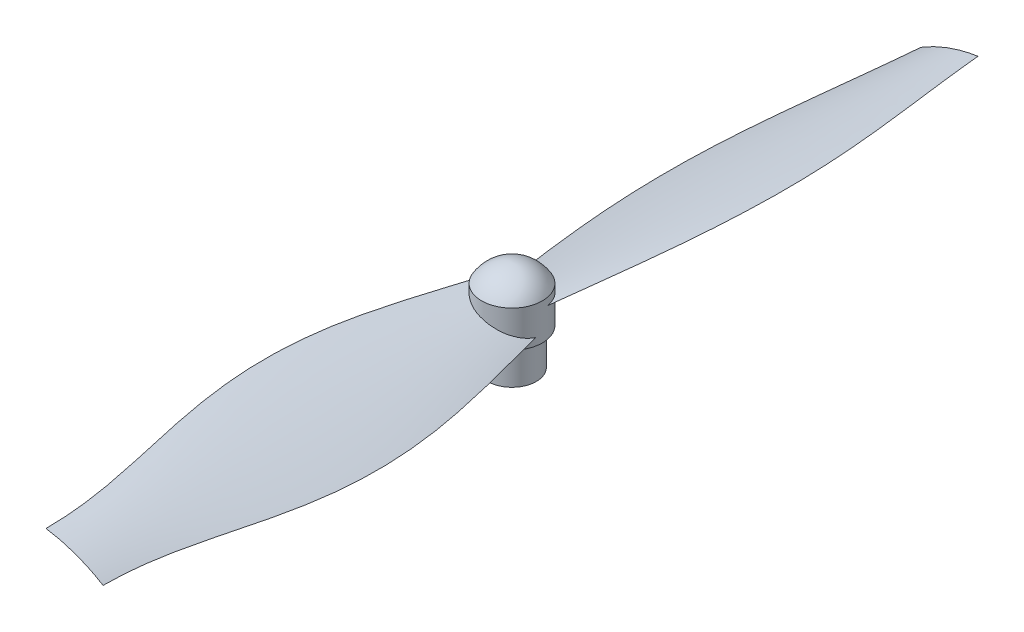
ISO-10303-21;
HEADER;
FILE_DESCRIPTION(('STEP AP214'),'2;1');
FILE_NAME('part.step','',(''),(''),'','','');
FILE_SCHEMA(('AUTOMOTIVE_DESIGN { 1 0 10303 214 1 1 1 1 }'));
ENDSEC;
DATA;
#1=APPLICATION_CONTEXT('core data for automotive mechanical design processes');
#2=APPLICATION_PROTOCOL_DEFINITION('international standard','automotive_design',2000,#1);
#3=PRODUCT_CONTEXT('',#1,'mechanical');
#4=PRODUCT('Part','Part','',(#3));
#5=PRODUCT_RELATED_PRODUCT_CATEGORY('part','',(#4));
#6=PRODUCT_DEFINITION_FORMATION('','',#4);
#7=PRODUCT_DEFINITION_CONTEXT('part definition',#1,'design');
#8=PRODUCT_DEFINITION('design','',#6,#7);
#9=PRODUCT_DEFINITION_SHAPE('','',#8);
#10=(LENGTH_UNIT() NAMED_UNIT(*) SI_UNIT(.MILLI.,.METRE.));
#11=(NAMED_UNIT(*) PLANE_ANGLE_UNIT() SI_UNIT($,.RADIAN.));
#12=(NAMED_UNIT(*) SI_UNIT($,.STERADIAN.) SOLID_ANGLE_UNIT());
#13=UNCERTAINTY_MEASURE_WITH_UNIT(LENGTH_MEASURE(1.E-05),#10,'distance_accuracy_value','');
#14=(GEOMETRIC_REPRESENTATION_CONTEXT(3) GLOBAL_UNCERTAINTY_ASSIGNED_CONTEXT((#13)) GLOBAL_UNIT_ASSIGNED_CONTEXT((#10,
#11,#12)) REPRESENTATION_CONTEXT('',''));
#15=CARTESIAN_POINT('',(0.,0.,0.));
#16=DIRECTION('',(0.,0.,1.));
#17=DIRECTION('',(1.,0.,0.));
#18=AXIS2_PLACEMENT_3D('',#15,#16,#17);
#19=CARTESIAN_POINT('',(4.69846310392954,10.7101007166284,0.));
#20=DIRECTION('',(0.342020143325673,-0.939692620785907,0.));
#21=DIRECTION('',(-0.939692620785907,-0.342020143325673,0.));
#22=AXIS2_PLACEMENT_3D('',#19,#20,#21);
#23=PLANE('',#22);
#24=DIRECTION('',(-0.939692620785907,-0.342020143325672,0.));
#25=VECTOR('',#24,1.);
#26=CARTESIAN_POINT('',(0.,9.,0.));
#27=LINE('',#26,#25);
#28=CARTESIAN_POINT('',(4.69846310392954,10.7101007166284,0.));
#29=VERTEX_POINT('',#28);
#30=CARTESIAN_POINT('',(-4.69846310392954,7.28989928337163,0.));
#31=VERTEX_POINT('',#30);
#32=EDGE_CURVE('E86',#29,#31,#27,.T.);
#33=ORIENTED_EDGE('',*,*,#32,.T.);
#34=CARTESIAN_POINT('',(-4.69846310392954,7.28989928337163,0.));
#35=CARTESIAN_POINT('',(-4.69846310392954,7.28989928337163,-0.679869268479036));
#36=CARTESIAN_POINT('',(-13.5458454476314,4.06971545909178,-38.1838953513858));
#37=CARTESIAN_POINT('',(-7.20431009269195,6.37784556783652,-54.6666666666667));
#38=CARTESIAN_POINT('',(-4.69846310392953,7.28989928337164,-72.));
#39=B_SPLINE_CURVE_WITH_KNOTS('',3,(#34,#35,#36,#37,#38),.UNSPECIFIED.,.F.,.F.,(4,1,4),(0.,
0.279461519936665,1.),.UNSPECIFIED.);
#40=CARTESIAN_POINT('',(-4.69846310392953,7.28989928337164,-72.));
#41=VERTEX_POINT('',#40);
#42=EDGE_CURVE('E85',#31,#41,#39,.T.);
#43=ORIENTED_EDGE('',*,*,#42,.T.);
#44=DIRECTION('',(0.939692620785907,0.342020143325673,0.));
#45=VECTOR('',#44,1.);
#46=CARTESIAN_POINT('',(0.,9.00000000000001,-72.));
#47=LINE('',#46,#45);
#48=CARTESIAN_POINT('',(4.69846310392953,10.7101007166284,-72.));
#49=VERTEX_POINT('',#48);
#50=EDGE_CURVE('E72',#41,#49,#47,.T.);
#51=ORIENTED_EDGE('',*,*,#50,.T.);
#52=CARTESIAN_POINT('',(4.69846310392954,10.7101007166284,0.));
#53=CARTESIAN_POINT('',(4.69846310392954,10.7101007166284,-0.67986926847904));
#54=CARTESIAN_POINT('',(13.5458454476314,13.9302845409082,-38.1838953513861));
#55=CARTESIAN_POINT('',(7.20431009269195,11.6221544321635,-54.6666666666667));
#56=CARTESIAN_POINT('',(4.69846310392953,10.7101007166284,-72.));
#57=B_SPLINE_CURVE_WITH_KNOTS('',3,(#52,#53,#54,#55,#56),.UNSPECIFIED.,.F.,.F.,(4,1,4),(0.,
0.279461519936665,1.),.UNSPECIFIED.);
#58=EDGE_CURVE('E84',#49,#29,#57,.F.);
#59=ORIENTED_EDGE('',*,*,#58,.T.);
#60=EDGE_LOOP('',(#33,#43,#51,#59));
#61=FACE_BOUND('',#60,.T.);
#62=ADVANCED_FACE('F53',(#61),#23,.T.);
#63=CARTESIAN_POINT('',(-4.69846310392954,7.28989928337164,0.));
#64=CARTESIAN_POINT('',(-4.69846310392954,7.28989928337164,-0.679869268479036));
#65=CARTESIAN_POINT('',(-13.5458454476314,4.06971545909173,-38.1838953513858));
#66=CARTESIAN_POINT('',(-7.20431009269197,6.3778455678365,-54.6666666666667));
#67=CARTESIAN_POINT('',(-4.69846310392953,7.28989928337164,-72.));
#68=CARTESIAN_POINT('',(-1.82850177394058,9.05116134838688,0.));
#69=CARTESIAN_POINT('',(-1.82850177394058,9.05116134838688,-0.679869268479038));
#70=CARTESIAN_POINT('',(-4.74599248789099,7.99901139309018,-38.1838953513859));
#71=CARTESIAN_POINT('',(-2.66378410352807,8.74714344320849,-54.6666666666667));
#72=CARTESIAN_POINT('',(-1.82850177394058,9.05116134838688,-72.));
#73=CARTESIAN_POINT('',(1.36782774232243,10.2145301512131,0.));
#74=CARTESIAN_POINT('',(1.36782774232243,10.2145301512131,-0.679869268479039));
#75=CARTESIAN_POINT('',(4.27906424639223,11.2838634069331,-38.183895351386));
#76=CARTESIAN_POINT('',(2.20311007190989,10.5185480563915,-54.6666666666667));
#77=CARTESIAN_POINT('',(1.36782774232243,10.2145301512131,-72.));
#78=CARTESIAN_POINT('',(4.69846310392954,10.7101007166284,0.));
#79=CARTESIAN_POINT('',(4.69846310392954,10.7101007166284,-0.67986926847904));
#80=CARTESIAN_POINT('',(13.5458454476314,13.9302845409082,-38.1838953513861));
#81=CARTESIAN_POINT('',(7.20431009269195,11.6221544321635,-54.6666666666667));
#82=CARTESIAN_POINT('',(4.69846310392953,10.7101007166284,-72.));
#83=B_SPLINE_SURFACE_WITH_KNOTS('',3,3,((#63,#64,#65,#66,#67),(#68,#69,#70,#71,#72),(#73,#74,
#75,#76,#77),(#78,#79,#80,#81,#82)),.UNSPECIFIED.,.F.,.F.,.F.,(4,4),(4,1,4),(0.,1.),(0.,
0.279461519936665,1.),.UNSPECIFIED.);
#84=CARTESIAN_POINT('',(-4.69846310392954,7.28989928337164,0.));
#85=CARTESIAN_POINT('',(-1.82850177394058,9.05116134838688,0.));
#86=CARTESIAN_POINT('',(1.36782774232243,10.2145301512131,0.));
#87=CARTESIAN_POINT('',(4.69846310392954,10.7101007166284,0.));
#88=B_SPLINE_CURVE_WITH_KNOTS('',3,(#84,#85,#86,#87),.UNSPECIFIED.,.F.,.F.,(4,4),(0.,1.),.UNSPECIFIED.);
#89=EDGE_CURVE('E13',#31,#29,#88,.T.);
#90=CARTESIAN_POINT('',(-4.69846310392953,7.28989928337164,-72.));
#91=CARTESIAN_POINT('',(-1.82850177394058,9.05116134838688,-72.));
#92=CARTESIAN_POINT('',(1.36782774232243,10.2145301512131,-72.));
#93=CARTESIAN_POINT('',(4.69846310392953,10.7101007166284,-72.));
#94=B_SPLINE_CURVE_WITH_KNOTS('',3,(#90,#91,#92,#93),.UNSPECIFIED.,.F.,.F.,(4,4),(0.,1.),.UNSPECIFIED.);
#95=EDGE_CURVE('E58',#49,#41,#94,.F.);
#96=ORIENTED_EDGE('',*,*,#89,.T.);
#97=ORIENTED_EDGE('',*,*,#58,.F.);
#98=ORIENTED_EDGE('',*,*,#95,.T.);
#99=ORIENTED_EDGE('',*,*,#42,.F.);
#100=EDGE_LOOP('',(#96,#97,#98,#99));
#101=FACE_BOUND('',#100,.T.);
#102=ADVANCED_FACE('F54',(#101),#83,.T.);
#103=OPEN_SHELL('',(#62,#102));
#104=SHELL_BASED_SURFACE_MODEL('B2',(#103));
#105=CARTESIAN_POINT('',(-4.69846310392954,10.7101007166284,0.));
#106=CARTESIAN_POINT('',(-4.69846310392954,10.7101007166284,0.679869268479038));
#107=CARTESIAN_POINT('',(-14.03179298249,14.1071549790119,38.1938255156309));
#108=CARTESIAN_POINT('',(-4.69846310392954,10.7101007166284,54.6154602527929));
#109=CARTESIAN_POINT('',(-4.69846310392954,10.7101007166284,72.));
#110=CARTESIAN_POINT('',(-1.36782774232243,10.2145301512131,0.));
#111=CARTESIAN_POINT('',(-1.36782774232243,10.2145301512131,0.679869268479038));
#112=CARTESIAN_POINT('',(-4.44104675804527,11.3428202196379,38.1938255156309));
#113=CARTESIAN_POINT('',(-1.36782774232243,10.2145301512131,54.6154602527929));
#114=CARTESIAN_POINT('',(-1.36782774232243,10.2145301512131,72.));
#115=CARTESIAN_POINT('',(1.82850177394058,9.05116134838688,0.));
#116=CARTESIAN_POINT('',(1.82850177394059,9.05116134838688,0.679869268479038));
#117=CARTESIAN_POINT('',(4.90797499953851,7.9400545803703,38.1938255156309));
#118=CARTESIAN_POINT('',(1.82850177394058,9.05116134838688,54.6154602527929));
#119=CARTESIAN_POINT('',(1.82850177394058,9.05116134838688,72.));
#120=CARTESIAN_POINT('',(4.69846310392954,7.28989928337164,0.));
#121=CARTESIAN_POINT('',(4.69846310392954,7.28989928337164,0.679869268479038));
#122=CARTESIAN_POINT('',(14.0317929824901,3.89284502098825,38.1938255156309));
#123=CARTESIAN_POINT('',(4.69846310392954,7.28989928337164,54.6154602527929));
#124=CARTESIAN_POINT('',(4.69846310392954,7.28989928337164,72.));
#125=B_SPLINE_SURFACE_WITH_KNOTS('',3,3,((#105,#106,#107,#108,#109),(#110,#111,#112,#113,#114),
(#115,#116,#117,#118,#119),(#120,#121,#122,#123,#124)),.UNSPECIFIED.,.F.,.F.,.F.,(4,4),(4,1,4),
(0.,1.),(0.,0.279461520340345,1.),.UNSPECIFIED.);
#126=CARTESIAN_POINT('',(-4.69846310392954,10.7101007166284,0.));
#127=CARTESIAN_POINT('',(-1.36782774232243,10.2145301512131,0.));
#128=CARTESIAN_POINT('',(1.82850177394058,9.05116134838688,0.));
#129=CARTESIAN_POINT('',(4.69846310392954,7.28989928337164,0.));
#130=B_SPLINE_CURVE_WITH_KNOTS('',3,(#126,#127,#128,#129),.UNSPECIFIED.,.F.,.F.,(4,4),(0.,1.),.UNSPECIFIED.);
#131=CARTESIAN_POINT('',(-4.69846310392954,10.7101007166284,0.));
#132=VERTEX_POINT('',#131);
#133=CARTESIAN_POINT('',(4.69846310392954,7.28989928337164,0.));
#134=VERTEX_POINT('',#133);
#135=EDGE_CURVE('E51',#132,#134,#130,.T.);
#136=CARTESIAN_POINT('',(4.69846310392954,7.28989928337164,0.));
#137=CARTESIAN_POINT('',(4.69846310392954,7.28989928337164,0.679869268479038));
#138=CARTESIAN_POINT('',(14.0317929824901,3.89284502098825,38.1938255156309));
#139=CARTESIAN_POINT('',(4.69846310392954,7.28989928337164,54.6154602527929));
#140=CARTESIAN_POINT('',(4.69846310392954,7.28989928337164,72.));
#141=B_SPLINE_CURVE_WITH_KNOTS('',3,(#136,#137,#138,#139,#140),.UNSPECIFIED.,.F.,.F.,(4,1,4),
(0.,0.279461520340345,1.),.UNSPECIFIED.);
#142=CARTESIAN_POINT('',(4.69846310392954,7.28989928337164,72.));
#143=VERTEX_POINT('',#142);
#144=EDGE_CURVE('E163',#134,#143,#141,.T.);
#145=CARTESIAN_POINT('',(-4.69846310392954,10.7101007166284,72.));
#146=CARTESIAN_POINT('',(-1.36782774232243,10.2145301512131,72.));
#147=CARTESIAN_POINT('',(1.82850177394058,9.05116134838688,72.));
#148=CARTESIAN_POINT('',(4.69846310392954,7.28989928337164,72.));
#149=B_SPLINE_CURVE_WITH_KNOTS('',3,(#145,#146,#147,#148),.UNSPECIFIED.,.F.,.F.,(4,4),(0.,1.),.UNSPECIFIED.);
#150=CARTESIAN_POINT('',(-4.69846310392954,10.7101007166284,72.));
#151=VERTEX_POINT('',#150);
#152=EDGE_CURVE('E171',#143,#151,#149,.F.);
#153=CARTESIAN_POINT('',(-4.69846310392954,10.7101007166284,0.));
#154=CARTESIAN_POINT('',(-4.69846310392954,10.7101007166284,0.679869268479038));
#155=CARTESIAN_POINT('',(-14.03179298249,14.1071549790119,38.1938255156309));
#156=CARTESIAN_POINT('',(-4.69846310392954,10.7101007166284,54.6154602527929));
#157=CARTESIAN_POINT('',(-4.69846310392954,10.7101007166284,72.));
#158=B_SPLINE_CURVE_WITH_KNOTS('',3,(#153,#154,#155,#156,#157),.UNSPECIFIED.,.F.,.F.,(4,1,4),
(0.,0.279461520340345,1.),.UNSPECIFIED.);
#159=EDGE_CURVE('E155',#151,#132,#158,.F.);
#160=ORIENTED_EDGE('',*,*,#135,.T.);
#161=ORIENTED_EDGE('',*,*,#144,.T.);
#162=ORIENTED_EDGE('',*,*,#152,.T.);
#163=ORIENTED_EDGE('',*,*,#159,.T.);
#164=EDGE_LOOP('',(#160,#161,#162,#163));
#165=FACE_BOUND('',#164,.T.);
#166=ADVANCED_FACE('F152',(#165),#125,.T.);
#167=OPEN_SHELL('',(#166));
#168=SHELL_BASED_SURFACE_MODEL('B7',(#167));
#169=CARTESIAN_POINT('',(0.,0.,0.));
#170=DIRECTION('',(0.,-1.,0.));
#171=DIRECTION('',(0.,0.,-1.));
#172=AXIS2_PLACEMENT_3D('',#169,#170,#171);
#173=PLANE('',#172);
#174=DIRECTION('',(0.5,0.,0.866025403784439));
#175=VECTOR('',#174,1.);
#176=CARTESIAN_POINT('',(1.44337567297407,0.,-2.5));
#177=LINE('',#176,#175);
#178=CARTESIAN_POINT('',(1.44337567297407,0.,-2.5));
#179=VERTEX_POINT('',#178);
#180=CARTESIAN_POINT('',(2.88675134594813,0.,0.));
#181=VERTEX_POINT('',#180);
#182=EDGE_CURVE('E238',#179,#181,#177,.T.);
#183=ORIENTED_EDGE('',*,*,#182,.F.);
#184=DIRECTION('',(1.,0.,0.));
#185=VECTOR('',#184,1.);
#186=CARTESIAN_POINT('',(-1.44337567297406,0.,-2.5));
#187=LINE('',#186,#185);
#188=CARTESIAN_POINT('',(-1.44337567297406,0.,-2.5));
#189=VERTEX_POINT('',#188);
#190=EDGE_CURVE('E297',#189,#179,#187,.T.);
#191=ORIENTED_EDGE('',*,*,#190,.F.);
#192=DIRECTION('',(0.5,0.,-0.866025403784438));
#193=VECTOR('',#192,1.);
#194=CARTESIAN_POINT('',(-2.88675134594813,0.,0.));
#195=LINE('',#194,#193);
#196=CARTESIAN_POINT('',(-2.88675134594813,0.,0.));
#197=VERTEX_POINT('',#196);
#198=EDGE_CURVE('E300',#197,#189,#195,.T.);
#199=ORIENTED_EDGE('',*,*,#198,.F.);
#200=DIRECTION('',(-0.5,0.,-0.866025403784438));
#201=VECTOR('',#200,1.);
#202=CARTESIAN_POINT('',(-1.44337567297406,0.,2.5));
#203=LINE('',#202,#201);
#204=CARTESIAN_POINT('',(-1.44337567297406,0.,2.5));
#205=VERTEX_POINT('',#204);
#206=EDGE_CURVE('E316',#205,#197,#203,.T.);
#207=ORIENTED_EDGE('',*,*,#206,.F.);
#208=DIRECTION('',(-1.,0.,0.));
#209=VECTOR('',#208,1.);
#210=CARTESIAN_POINT('',(1.44337567297406,0.,2.5));
#211=LINE('',#210,#209);
#212=CARTESIAN_POINT('',(1.44337567297406,0.,2.5));
#213=VERTEX_POINT('',#212);
#214=EDGE_CURVE('E313',#213,#205,#211,.T.);
#215=ORIENTED_EDGE('',*,*,#214,.F.);
#216=DIRECTION('',(-0.5,0.,0.866025403784438));
#217=VECTOR('',#216,1.);
#218=CARTESIAN_POINT('',(2.88675134594813,0.,0.));
#219=LINE('',#218,#217);
#220=EDGE_CURVE('E311',#181,#213,#219,.T.);
#221=ORIENTED_EDGE('',*,*,#220,.F.);
#222=EDGE_LOOP('',(#183,#191,#199,#207,#215,#221));
#223=FACE_BOUND('',#222,.T.);
#224=CARTESIAN_POINT('',(0.,0.,0.));
#225=DIRECTION('',(0.,-1.,0.));
#226=DIRECTION('',(0.,0.,-1.));
#227=AXIS2_PLACEMENT_3D('',#224,#225,#226);
#228=CIRCLE('',#227,4.);
#229=CARTESIAN_POINT('',(0.,0.,-4.));
#230=VERTEX_POINT('',#229);
#231=EDGE_CURVE('E323',#230,#230,#228,.T.);
#232=ORIENTED_EDGE('',*,*,#231,.T.);
#233=EDGE_LOOP('',(#232));
#234=FACE_BOUND('',#233,.T.);
#235=ADVANCED_FACE('F224',(#223,#234),#173,.T.);
#236=CARTESIAN_POINT('',(0.,9.00326916134687,0.19803850319188));
#237=DIRECTION('',(-1.,0.,0.));
#238=DIRECTION('',(0.,0.,-1.));
#239=AXIS2_PLACEMENT_3D('',#236,#237,#238);
#240=CIRCLE('',#239,6.);
#241=TRIMMED_CURVE('',#240,(PARAMETER_VALUE(-1.53778391366149)),
(PARAMETER_VALUE(1.53778391366149)),.T.,.PARAMETER.);
#242=CARTESIAN_POINT('',(0.,9.00326916134687,0.));
#243=DIRECTION('',(0.,-1.,0.));
#244=AXIS1_PLACEMENT('',#242,#243);
#245=SURFACE_OF_REVOLUTION('',#241,#244);
#246=CARTESIAN_POINT('',(0.,15.,0.));
#247=VERTEX_POINT('',#246);
#248=VERTEX_LOOP('',#247);
#249=FACE_BOUND('',#248,.T.);
#250=CARTESIAN_POINT('',(0.,12.,0.));
#251=DIRECTION('',(0.,-1.,0.));
#252=DIRECTION('',(0.,0.,-1.));
#253=AXIS2_PLACEMENT_3D('',#250,#251,#252);
#254=CIRCLE('',#253,5.);
#255=CARTESIAN_POINT('',(0.,12.,-5.));
#256=VERTEX_POINT('',#255);
#257=EDGE_CURVE('E150',#256,#256,#254,.T.);
#258=ORIENTED_EDGE('',*,*,#257,.F.);
#259=EDGE_LOOP('',(#258));
#260=FACE_BOUND('',#259,.T.);
#261=ADVANCED_FACE('F343',(#249,#260),#245,.T.);
#262=CARTESIAN_POINT('',(0.,0.,0.));
#263=DIRECTION('',(0.,-1.,0.));
#264=DIRECTION('',(0.,0.,-1.));
#265=AXIS2_PLACEMENT_3D('',#262,#263,#264);
#266=CYLINDRICAL_SURFACE('',#265,5.);
#267=ORIENTED_EDGE('',*,*,#257,.T.);
#268=EDGE_LOOP('',(#267));
#269=FACE_BOUND('',#268,.T.);
#270=CARTESIAN_POINT('',(0.,6.,0.));
#271=DIRECTION('',(0.,-1.,0.));
#272=DIRECTION('',(0.,0.,-1.));
#273=AXIS2_PLACEMENT_3D('',#270,#271,#272);
#274=CIRCLE('',#273,5.);
#275=CARTESIAN_POINT('',(0.,6.,-5.));
#276=VERTEX_POINT('',#275);
#277=EDGE_CURVE('E231',#276,#276,#274,.T.);
#278=ORIENTED_EDGE('',*,*,#277,.F.);
#279=EDGE_LOOP('',(#278));
#280=FACE_BOUND('',#279,.T.);
#281=ADVANCED_FACE('F341',(#269,#280),#266,.T.);
#282=CARTESIAN_POINT('',(4.,6.,0.));
#283=DIRECTION('',(0.,-1.,0.));
#284=DIRECTION('',(0.,0.,-1.));
#285=AXIS2_PLACEMENT_3D('',#282,#283,#284);
#286=PLANE('',#285);
#287=ORIENTED_EDGE('',*,*,#277,.T.);
#288=EDGE_LOOP('',(#287));
#289=FACE_BOUND('',#288,.T.);
#290=CARTESIAN_POINT('',(0.,6.,0.));
#291=DIRECTION('',(0.,-1.,0.));
#292=DIRECTION('',(0.,0.,-1.));
#293=AXIS2_PLACEMENT_3D('',#290,#291,#292);
#294=CIRCLE('',#293,4.);
#295=CARTESIAN_POINT('',(0.,6.,-4.));
#296=VERTEX_POINT('',#295);
#297=EDGE_CURVE('E333',#296,#296,#294,.T.);
#298=ORIENTED_EDGE('',*,*,#297,.F.);
#299=EDGE_LOOP('',(#298));
#300=FACE_BOUND('',#299,.T.);
#301=ADVANCED_FACE('F338',(#289,#300),#286,.T.);
#302=CARTESIAN_POINT('',(0.,0.,0.));
#303=DIRECTION('',(0.,-1.,0.));
#304=DIRECTION('',(0.,0.,-1.));
#305=AXIS2_PLACEMENT_3D('',#302,#303,#304);
#306=CYLINDRICAL_SURFACE('',#305,4.);
#307=ORIENTED_EDGE('',*,*,#297,.T.);
#308=EDGE_LOOP('',(#307));
#309=FACE_BOUND('',#308,.T.);
#310=ORIENTED_EDGE('',*,*,#231,.F.);
#311=EDGE_LOOP('',(#310));
#312=FACE_BOUND('',#311,.T.);
#313=ADVANCED_FACE('F350',(#309,#312),#306,.T.);
#314=CARTESIAN_POINT('',(1.44337567297407,7.,-2.5));
#315=DIRECTION('',(0.866025403784438,0.,-0.5));
#316=DIRECTION('',(-0.5,0.,-0.866025403784439));
#317=AXIS2_PLACEMENT_3D('',#314,#315,#316);
#318=PLANE('',#317);
#319=ORIENTED_EDGE('',*,*,#182,.T.);
#320=DIRECTION('',(0.,-1.,0.));
#321=VECTOR('',#320,1.);
#322=CARTESIAN_POINT('',(2.88675134594813,7.,0.));
#323=LINE('',#322,#321);
#324=CARTESIAN_POINT('',(2.88675134594813,7.,0.));
#325=VERTEX_POINT('',#324);
#326=EDGE_CURVE('E274',#325,#181,#323,.T.);
#327=ORIENTED_EDGE('',*,*,#326,.F.);
#328=DIRECTION('',(0.5,0.,0.866025403784439));
#329=VECTOR('',#328,1.);
#330=CARTESIAN_POINT('',(1.44337567297407,7.,-2.5));
#331=LINE('',#330,#329);
#332=CARTESIAN_POINT('',(1.44337567297407,7.,-2.5));
#333=VERTEX_POINT('',#332);
#334=EDGE_CURVE('E278',#333,#325,#331,.T.);
#335=ORIENTED_EDGE('',*,*,#334,.F.);
#336=DIRECTION('',(0.,-1.,0.));
#337=VECTOR('',#336,1.);
#338=CARTESIAN_POINT('',(1.44337567297407,7.,-2.5));
#339=LINE('',#338,#337);
#340=EDGE_CURVE('E321',#333,#179,#339,.T.);
#341=ORIENTED_EDGE('',*,*,#340,.T.);
#342=EDGE_LOOP('',(#319,#327,#335,#341));
#343=FACE_BOUND('',#342,.T.);
#344=ADVANCED_FACE('F276',(#343),#318,.F.);
#345=CARTESIAN_POINT('',(-1.44337567297406,7.,-2.5));
#346=DIRECTION('',(0.,0.,-1.));
#347=DIRECTION('',(-1.,0.,0.));
#348=AXIS2_PLACEMENT_3D('',#345,#346,#347);
#349=PLANE('',#348);
#350=ORIENTED_EDGE('',*,*,#190,.T.);
#351=ORIENTED_EDGE('',*,*,#340,.F.);
#352=DIRECTION('',(1.,0.,0.));
#353=VECTOR('',#352,1.);
#354=CARTESIAN_POINT('',(-1.44337567297406,7.,-2.5));
#355=LINE('',#354,#353);
#356=CARTESIAN_POINT('',(-1.44337567297406,7.,-2.5));
#357=VERTEX_POINT('',#356);
#358=EDGE_CURVE('E284',#357,#333,#355,.T.);
#359=ORIENTED_EDGE('',*,*,#358,.F.);
#360=DIRECTION('',(0.,-1.,0.));
#361=VECTOR('',#360,1.);
#362=CARTESIAN_POINT('',(-1.44337567297406,7.,-2.5));
#363=LINE('',#362,#361);
#364=EDGE_CURVE('E324',#357,#189,#363,.T.);
#365=ORIENTED_EDGE('',*,*,#364,.T.);
#366=EDGE_LOOP('',(#350,#351,#359,#365));
#367=FACE_BOUND('',#366,.T.);
#368=ADVANCED_FACE('F366',(#367),#349,.F.);
#369=CARTESIAN_POINT('',(-2.88675134594813,7.,0.));
#370=DIRECTION('',(-0.866025403784438,0.,-0.5));
#371=DIRECTION('',(-0.5,0.,0.866025403784438));
#372=AXIS2_PLACEMENT_3D('',#369,#370,#371);
#373=PLANE('',#372);
#374=ORIENTED_EDGE('',*,*,#198,.T.);
#375=ORIENTED_EDGE('',*,*,#364,.F.);
#376=DIRECTION('',(0.5,0.,-0.866025403784438));
#377=VECTOR('',#376,1.);
#378=CARTESIAN_POINT('',(-2.88675134594813,7.,0.));
#379=LINE('',#378,#377);
#380=CARTESIAN_POINT('',(-2.88675134594813,7.,0.));
#381=VERTEX_POINT('',#380);
#382=EDGE_CURVE('E307',#381,#357,#379,.T.);
#383=ORIENTED_EDGE('',*,*,#382,.F.);
#384=DIRECTION('',(0.,-1.,0.));
#385=VECTOR('',#384,1.);
#386=CARTESIAN_POINT('',(-2.88675134594813,7.,0.));
#387=LINE('',#386,#385);
#388=EDGE_CURVE('E326',#381,#197,#387,.T.);
#389=ORIENTED_EDGE('',*,*,#388,.T.);
#390=EDGE_LOOP('',(#374,#375,#383,#389));
#391=FACE_BOUND('',#390,.T.);
#392=ADVANCED_FACE('F378',(#391),#373,.F.);
#393=CARTESIAN_POINT('',(-1.44337567297406,7.,2.5));
#394=DIRECTION('',(-0.866025403784438,0.,0.5));
#395=DIRECTION('',(0.5,0.,0.866025403784439));
#396=AXIS2_PLACEMENT_3D('',#393,#394,#395);
#397=PLANE('',#396);
#398=ORIENTED_EDGE('',*,*,#206,.T.);
#399=ORIENTED_EDGE('',*,*,#388,.F.);
#400=DIRECTION('',(-0.5,0.,-0.866025403784438));
#401=VECTOR('',#400,1.);
#402=CARTESIAN_POINT('',(-1.44337567297406,7.,2.5));
#403=LINE('',#402,#401);
#404=CARTESIAN_POINT('',(-1.44337567297406,7.,2.5));
#405=VERTEX_POINT('',#404);
#406=EDGE_CURVE('E304',#405,#381,#403,.T.);
#407=ORIENTED_EDGE('',*,*,#406,.F.);
#408=DIRECTION('',(0.,-1.,0.));
#409=VECTOR('',#408,1.);
#410=CARTESIAN_POINT('',(-1.44337567297406,7.,2.5));
#411=LINE('',#410,#409);
#412=EDGE_CURVE('E328',#405,#205,#411,.T.);
#413=ORIENTED_EDGE('',*,*,#412,.T.);
#414=EDGE_LOOP('',(#398,#399,#407,#413));
#415=FACE_BOUND('',#414,.T.);
#416=ADVANCED_FACE('F374',(#415),#397,.F.);
#417=CARTESIAN_POINT('',(1.44337567297406,7.,2.5));
#418=DIRECTION('',(0.,0.,1.));
#419=DIRECTION('',(1.,0.,0.));
#420=AXIS2_PLACEMENT_3D('',#417,#418,#419);
#421=PLANE('',#420);
#422=ORIENTED_EDGE('',*,*,#214,.T.);
#423=ORIENTED_EDGE('',*,*,#412,.F.);
#424=DIRECTION('',(-1.,0.,0.));
#425=VECTOR('',#424,1.);
#426=CARTESIAN_POINT('',(1.44337567297406,7.,2.5));
#427=LINE('',#426,#425);
#428=CARTESIAN_POINT('',(1.44337567297406,7.,2.5));
#429=VERTEX_POINT('',#428);
#430=EDGE_CURVE('E292',#429,#405,#427,.T.);
#431=ORIENTED_EDGE('',*,*,#430,.F.);
#432=DIRECTION('',(0.,-1.,0.));
#433=VECTOR('',#432,1.);
#434=CARTESIAN_POINT('',(1.44337567297406,7.,2.5));
#435=LINE('',#434,#433);
#436=EDGE_CURVE('E283',#429,#213,#435,.T.);
#437=ORIENTED_EDGE('',*,*,#436,.T.);
#438=EDGE_LOOP('',(#422,#423,#431,#437));
#439=FACE_BOUND('',#438,.T.);
#440=ADVANCED_FACE('F371',(#439),#421,.F.);
#441=CARTESIAN_POINT('',(2.88675134594813,7.,0.));
#442=DIRECTION('',(0.866025403784438,0.,0.5));
#443=DIRECTION('',(0.5,0.,-0.866025403784438));
#444=AXIS2_PLACEMENT_3D('',#441,#442,#443);
#445=PLANE('',#444);
#446=ORIENTED_EDGE('',*,*,#220,.T.);
#447=ORIENTED_EDGE('',*,*,#436,.F.);
#448=DIRECTION('',(-0.5,0.,0.866025403784438));
#449=VECTOR('',#448,1.);
#450=CARTESIAN_POINT('',(2.88675134594813,7.,0.));
#451=LINE('',#450,#449);
#452=EDGE_CURVE('E287',#325,#429,#451,.T.);
#453=ORIENTED_EDGE('',*,*,#452,.F.);
#454=ORIENTED_EDGE('',*,*,#326,.T.);
#455=EDGE_LOOP('',(#446,#447,#453,#454));
#456=FACE_BOUND('',#455,.T.);
#457=ADVANCED_FACE('F288',(#456),#445,.F.);
#458=CARTESIAN_POINT('',(0.,7.,0.));
#459=DIRECTION('',(0.,-1.,0.));
#460=DIRECTION('',(0.,0.,-1.));
#461=AXIS2_PLACEMENT_3D('',#458,#459,#460);
#462=PLANE('',#461);
#463=ORIENTED_EDGE('',*,*,#334,.T.);
#464=ORIENTED_EDGE('',*,*,#452,.T.);
#465=ORIENTED_EDGE('',*,*,#430,.T.);
#466=ORIENTED_EDGE('',*,*,#406,.T.);
#467=ORIENTED_EDGE('',*,*,#382,.T.);
#468=ORIENTED_EDGE('',*,*,#358,.T.);
#469=EDGE_LOOP('',(#463,#464,#465,#466,#467,#468));
#470=FACE_BOUND('',#469,.T.);
#471=ADVANCED_FACE('F294',(#470),#462,.T.);
#472=CLOSED_SHELL('',(#235,#261,#281,#301,#313,#344,#368,#392,#416,#440,#457,#471));
#473=MANIFOLD_SOLID_BREP('B45',#472);
#474=ADVANCED_BREP_SHAPE_REPRESENTATION('',(#18,#473),#14);
#475=MANIFOLD_SURFACE_SHAPE_REPRESENTATION('',(#18,#104,#168),#14);
#476=SHAPE_REPRESENTATION('',(#18),#14);
#477=SHAPE_DEFINITION_REPRESENTATION(#9,#476);
#478=SHAPE_REPRESENTATION_RELATIONSHIP('','',#476,#474);
#479=SHAPE_REPRESENTATION_RELATIONSHIP('','',#476,#475);
ENDSEC;
END-ISO-10303-21;
